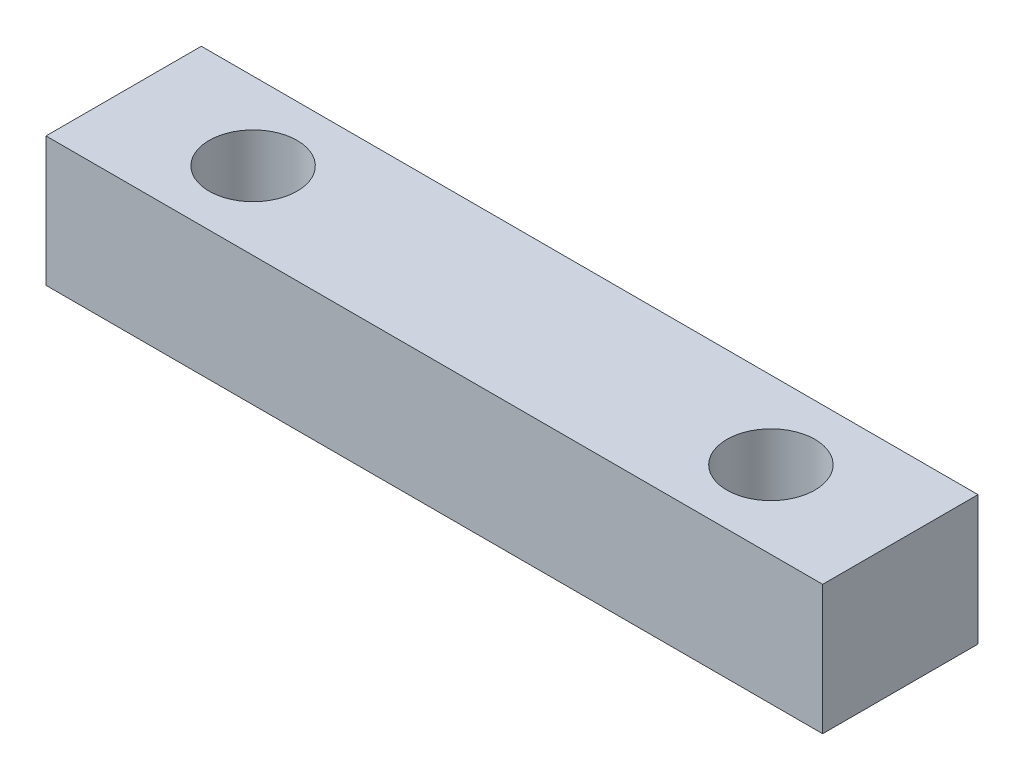
ISO-10303-21;
HEADER;
FILE_DESCRIPTION(('STEP AP214'),'2;1');
FILE_NAME('part.step','',(''),(''),'','','');
FILE_SCHEMA(('AUTOMOTIVE_DESIGN { 1 0 10303 214 1 1 1 1 }'));
ENDSEC;
DATA;
#1=APPLICATION_CONTEXT('core data for automotive mechanical design processes');
#2=APPLICATION_PROTOCOL_DEFINITION('international standard','automotive_design',2000,#1);
#3=PRODUCT_CONTEXT('',#1,'mechanical');
#4=PRODUCT('Part','Part','',(#3));
#5=PRODUCT_RELATED_PRODUCT_CATEGORY('part','',(#4));
#6=PRODUCT_DEFINITION_FORMATION('','',#4);
#7=PRODUCT_DEFINITION_CONTEXT('part definition',#1,'design');
#8=PRODUCT_DEFINITION('design','',#6,#7);
#9=PRODUCT_DEFINITION_SHAPE('','',#8);
#10=(LENGTH_UNIT() NAMED_UNIT(*) SI_UNIT(.MILLI.,.METRE.));
#11=(NAMED_UNIT(*) PLANE_ANGLE_UNIT() SI_UNIT($,.RADIAN.));
#12=(NAMED_UNIT(*) SI_UNIT($,.STERADIAN.) SOLID_ANGLE_UNIT());
#13=UNCERTAINTY_MEASURE_WITH_UNIT(LENGTH_MEASURE(1.E-05),#10,'distance_accuracy_value','');
#14=(GEOMETRIC_REPRESENTATION_CONTEXT(3) GLOBAL_UNCERTAINTY_ASSIGNED_CONTEXT((#13)) GLOBAL_UNIT_ASSIGNED_CONTEXT((#10,
#11,#12)) REPRESENTATION_CONTEXT('',''));
#15=CARTESIAN_POINT('',(0.,0.,0.));
#16=DIRECTION('',(0.,0.,1.));
#17=DIRECTION('',(1.,0.,0.));
#18=AXIS2_PLACEMENT_3D('',#15,#16,#17);
#19=CARTESIAN_POINT('',(-15.,5.,3.));
#20=DIRECTION('',(1.,0.,0.));
#21=DIRECTION('',(0.,0.,-1.));
#22=AXIS2_PLACEMENT_3D('',#19,#20,#21);
#23=PLANE('',#22);
#24=DIRECTION('',(0.,0.,1.));
#25=VECTOR('',#24,1.);
#26=CARTESIAN_POINT('',(-15.,0.,3.));
#27=LINE('',#26,#25);
#28=CARTESIAN_POINT('',(-15.,0.,-3.));
#29=VERTEX_POINT('',#28);
#30=CARTESIAN_POINT('',(-15.,0.,3.));
#31=VERTEX_POINT('',#30);
#32=EDGE_CURVE('E95',#29,#31,#27,.T.);
#33=ORIENTED_EDGE('',*,*,#32,.T.);
#34=DIRECTION('',(0.,-1.,0.));
#35=VECTOR('',#34,1.);
#36=CARTESIAN_POINT('',(-15.,5.,3.));
#37=LINE('',#36,#35);
#38=CARTESIAN_POINT('',(-15.,5.,3.));
#39=VERTEX_POINT('',#38);
#40=EDGE_CURVE('E11',#39,#31,#37,.T.);
#41=ORIENTED_EDGE('',*,*,#40,.F.);
#42=DIRECTION('',(0.,0.,1.));
#43=VECTOR('',#42,1.);
#44=CARTESIAN_POINT('',(-15.,5.,3.));
#45=LINE('',#44,#43);
#46=CARTESIAN_POINT('',(-15.,5.,-3.));
#47=VERTEX_POINT('',#46);
#48=EDGE_CURVE('E83',#47,#39,#45,.T.);
#49=ORIENTED_EDGE('',*,*,#48,.F.);
#50=DIRECTION('',(0.,-1.,0.));
#51=VECTOR('',#50,1.);
#52=CARTESIAN_POINT('',(-15.,5.,-3.));
#53=LINE('',#52,#51);
#54=EDGE_CURVE('E91',#47,#29,#53,.T.);
#55=ORIENTED_EDGE('',*,*,#54,.T.);
#56=EDGE_LOOP('',(#33,#41,#49,#55));
#57=FACE_BOUND('',#56,.T.);
#58=ADVANCED_FACE('F32',(#57),#23,.F.);
#59=CARTESIAN_POINT('',(15.,5.,3.));
#60=DIRECTION('',(0.,0.,-1.));
#61=DIRECTION('',(-1.,0.,0.));
#62=AXIS2_PLACEMENT_3D('',#59,#60,#61);
#63=PLANE('',#62);
#64=DIRECTION('',(1.,0.,0.));
#65=VECTOR('',#64,1.);
#66=CARTESIAN_POINT('',(15.,0.,3.));
#67=LINE('',#66,#65);
#68=CARTESIAN_POINT('',(15.,0.,3.));
#69=VERTEX_POINT('',#68);
#70=EDGE_CURVE('E87',#31,#69,#67,.T.);
#71=ORIENTED_EDGE('',*,*,#70,.T.);
#72=DIRECTION('',(0.,-1.,0.));
#73=VECTOR('',#72,1.);
#74=CARTESIAN_POINT('',(15.,5.,3.));
#75=LINE('',#74,#73);
#76=CARTESIAN_POINT('',(15.,5.,3.));
#77=VERTEX_POINT('',#76);
#78=EDGE_CURVE('E40',#77,#69,#75,.T.);
#79=ORIENTED_EDGE('',*,*,#78,.F.);
#80=DIRECTION('',(1.,0.,0.));
#81=VECTOR('',#80,1.);
#82=CARTESIAN_POINT('',(15.,5.,3.));
#83=LINE('',#82,#81);
#84=EDGE_CURVE('E78',#39,#77,#83,.T.);
#85=ORIENTED_EDGE('',*,*,#84,.F.);
#86=ORIENTED_EDGE('',*,*,#40,.T.);
#87=EDGE_LOOP('',(#71,#79,#85,#86));
#88=FACE_BOUND('',#87,.T.);
#89=ADVANCED_FACE('F86',(#88),#63,.F.);
#90=CARTESIAN_POINT('',(15.,5.,3.));
#91=DIRECTION('',(-1.,0.,0.));
#92=DIRECTION('',(0.,0.,1.));
#93=AXIS2_PLACEMENT_3D('',#90,#91,#92);
#94=PLANE('',#93);
#95=DIRECTION('',(0.,0.,-1.));
#96=VECTOR('',#95,1.);
#97=CARTESIAN_POINT('',(15.,0.,3.));
#98=LINE('',#97,#96);
#99=CARTESIAN_POINT('',(15.,0.,-3.));
#100=VERTEX_POINT('',#99);
#101=EDGE_CURVE('E65',#69,#100,#98,.T.);
#102=ORIENTED_EDGE('',*,*,#101,.T.);
#103=DIRECTION('',(0.,-1.,0.));
#104=VECTOR('',#103,1.);
#105=CARTESIAN_POINT('',(15.,5.,-3.));
#106=LINE('',#105,#104);
#107=CARTESIAN_POINT('',(15.,5.,-3.));
#108=VERTEX_POINT('',#107);
#109=EDGE_CURVE('E88',#108,#100,#106,.T.);
#110=ORIENTED_EDGE('',*,*,#109,.F.);
#111=DIRECTION('',(0.,0.,-1.));
#112=VECTOR('',#111,1.);
#113=CARTESIAN_POINT('',(15.,5.,3.));
#114=LINE('',#113,#112);
#115=EDGE_CURVE('E81',#77,#108,#114,.T.);
#116=ORIENTED_EDGE('',*,*,#115,.F.);
#117=ORIENTED_EDGE('',*,*,#78,.T.);
#118=EDGE_LOOP('',(#102,#110,#116,#117));
#119=FACE_BOUND('',#118,.T.);
#120=ADVANCED_FACE('F89',(#119),#94,.F.);
#121=CARTESIAN_POINT('',(15.,5.,-3.));
#122=DIRECTION('',(0.,0.,1.));
#123=DIRECTION('',(1.,0.,0.));
#124=AXIS2_PLACEMENT_3D('',#121,#122,#123);
#125=PLANE('',#124);
#126=DIRECTION('',(-1.,0.,0.));
#127=VECTOR('',#126,1.);
#128=CARTESIAN_POINT('',(15.,0.,-3.));
#129=LINE('',#128,#127);
#130=EDGE_CURVE('E71',#100,#29,#129,.T.);
#131=ORIENTED_EDGE('',*,*,#130,.T.);
#132=ORIENTED_EDGE('',*,*,#54,.F.);
#133=DIRECTION('',(-1.,0.,0.));
#134=VECTOR('',#133,1.);
#135=CARTESIAN_POINT('',(15.,5.,-3.));
#136=LINE('',#135,#134);
#137=EDGE_CURVE('E48',#108,#47,#136,.T.);
#138=ORIENTED_EDGE('',*,*,#137,.F.);
#139=ORIENTED_EDGE('',*,*,#109,.T.);
#140=EDGE_LOOP('',(#131,#132,#138,#139));
#141=FACE_BOUND('',#140,.T.);
#142=ADVANCED_FACE('F103',(#141),#125,.F.);
#143=CARTESIAN_POINT('',(-15.,5.,-3.));
#144=DIRECTION('',(0.,1.,0.));
#145=DIRECTION('',(0.,0.,1.));
#146=AXIS2_PLACEMENT_3D('',#143,#144,#145);
#147=PLANE('',#146);
#148=CARTESIAN_POINT('',(10.,5.,0.));
#149=DIRECTION('',(0.,-1.,0.));
#150=DIRECTION('',(0.,0.,-1.));
#151=AXIS2_PLACEMENT_3D('',#148,#149,#150);
#152=CIRCLE('',#151,1.7);
#153=CARTESIAN_POINT('',(10.,5.,-1.7));
#154=VERTEX_POINT('',#153);
#155=EDGE_CURVE('E114',#154,#154,#152,.T.);
#156=ORIENTED_EDGE('',*,*,#155,.T.);
#157=EDGE_LOOP('',(#156));
#158=FACE_BOUND('',#157,.T.);
#159=CARTESIAN_POINT('',(-9.99999999999998,5.,0.));
#160=DIRECTION('',(0.,-1.,0.));
#161=DIRECTION('',(0.,0.,-1.));
#162=AXIS2_PLACEMENT_3D('',#159,#160,#161);
#163=CIRCLE('',#162,1.7);
#164=CARTESIAN_POINT('',(-9.99999999999998,5.,-1.7));
#165=VERTEX_POINT('',#164);
#166=EDGE_CURVE('E98',#165,#165,#163,.T.);
#167=ORIENTED_EDGE('',*,*,#166,.T.);
#168=EDGE_LOOP('',(#167));
#169=FACE_BOUND('',#168,.T.);
#170=ORIENTED_EDGE('',*,*,#48,.T.);
#171=ORIENTED_EDGE('',*,*,#84,.T.);
#172=ORIENTED_EDGE('',*,*,#115,.T.);
#173=ORIENTED_EDGE('',*,*,#137,.T.);
#174=EDGE_LOOP('',(#170,#171,#172,#173));
#175=FACE_BOUND('',#174,.T.);
#176=ADVANCED_FACE('F79',(#158,#169,#175),#147,.T.);
#177=CARTESIAN_POINT('',(-15.,0.,-3.));
#178=DIRECTION('',(0.,1.,0.));
#179=DIRECTION('',(0.,0.,1.));
#180=AXIS2_PLACEMENT_3D('',#177,#178,#179);
#181=PLANE('',#180);
#182=CARTESIAN_POINT('',(10.,0.,0.));
#183=DIRECTION('',(0.,-1.,0.));
#184=DIRECTION('',(0.,0.,-1.));
#185=AXIS2_PLACEMENT_3D('',#182,#183,#184);
#186=CIRCLE('',#185,1.7);
#187=CARTESIAN_POINT('',(10.,0.,-1.7));
#188=VERTEX_POINT('',#187);
#189=EDGE_CURVE('E117',#188,#188,#186,.T.);
#190=ORIENTED_EDGE('',*,*,#189,.F.);
#191=EDGE_LOOP('',(#190));
#192=FACE_BOUND('',#191,.T.);
#193=CARTESIAN_POINT('',(-9.99999999999998,0.,0.));
#194=DIRECTION('',(0.,-1.,0.));
#195=DIRECTION('',(0.,0.,-1.));
#196=AXIS2_PLACEMENT_3D('',#193,#194,#195);
#197=CIRCLE('',#196,1.7);
#198=CARTESIAN_POINT('',(-9.99999999999998,0.,-1.7));
#199=VERTEX_POINT('',#198);
#200=EDGE_CURVE('E111',#199,#199,#197,.T.);
#201=ORIENTED_EDGE('',*,*,#200,.F.);
#202=EDGE_LOOP('',(#201));
#203=FACE_BOUND('',#202,.T.);
#204=ORIENTED_EDGE('',*,*,#32,.F.);
#205=ORIENTED_EDGE('',*,*,#130,.F.);
#206=ORIENTED_EDGE('',*,*,#101,.F.);
#207=ORIENTED_EDGE('',*,*,#70,.F.);
#208=EDGE_LOOP('',(#204,#205,#206,#207));
#209=FACE_BOUND('',#208,.T.);
#210=ADVANCED_FACE('F106',(#192,#203,#209),#181,.F.);
#211=CARTESIAN_POINT('',(-9.99999999999998,0.,0.));
#212=DIRECTION('',(0.,-1.,0.));
#213=DIRECTION('',(0.,0.,-1.));
#214=AXIS2_PLACEMENT_3D('',#211,#212,#213);
#215=CYLINDRICAL_SURFACE('',#214,1.7);
#216=ORIENTED_EDGE('',*,*,#166,.F.);
#217=EDGE_LOOP('',(#216));
#218=FACE_BOUND('',#217,.T.);
#219=ORIENTED_EDGE('',*,*,#200,.T.);
#220=EDGE_LOOP('',(#219));
#221=FACE_BOUND('',#220,.T.);
#222=ADVANCED_FACE('F125',(#218,#221),#215,.F.);
#223=CARTESIAN_POINT('',(10.,0.,0.));
#224=DIRECTION('',(0.,-1.,0.));
#225=DIRECTION('',(0.,0.,-1.));
#226=AXIS2_PLACEMENT_3D('',#223,#224,#225);
#227=CYLINDRICAL_SURFACE('',#226,1.7);
#228=ORIENTED_EDGE('',*,*,#155,.F.);
#229=EDGE_LOOP('',(#228));
#230=FACE_BOUND('',#229,.T.);
#231=ORIENTED_EDGE('',*,*,#189,.T.);
#232=EDGE_LOOP('',(#231));
#233=FACE_BOUND('',#232,.T.);
#234=ADVANCED_FACE('F121',(#230,#233),#227,.F.);
#235=CLOSED_SHELL('',(#58,#89,#120,#142,#176,#210,#222,#234));
#236=MANIFOLD_SOLID_BREP('B2',#235);
#237=ADVANCED_BREP_SHAPE_REPRESENTATION('',(#18,#236),#14);
#238=SHAPE_DEFINITION_REPRESENTATION(#9,#237);
ENDSEC;
END-ISO-10303-21;
